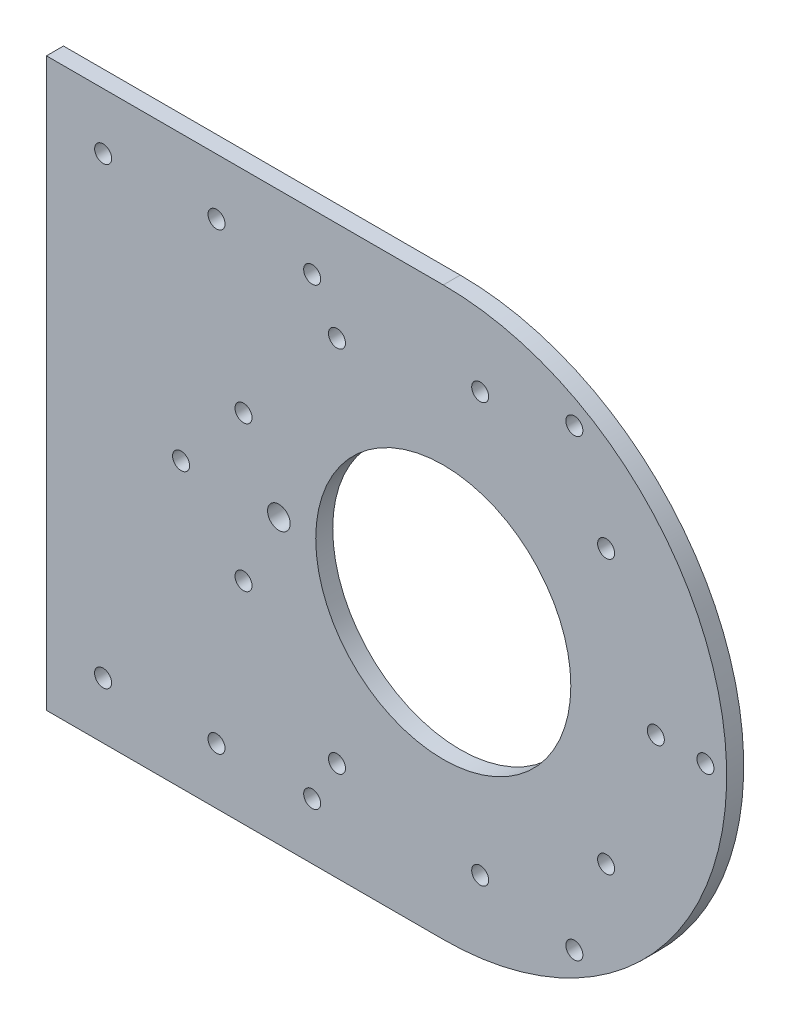
ISO-10303-21;
HEADER;
FILE_DESCRIPTION(('STEP AP214'),'2;1');
FILE_NAME('part.step','',(''),(''),'','','');
FILE_SCHEMA(('AUTOMOTIVE_DESIGN { 1 0 10303 214 1 1 1 1 }'));
ENDSEC;
DATA;
#1=APPLICATION_CONTEXT('core data for automotive mechanical design processes');
#2=APPLICATION_PROTOCOL_DEFINITION('international standard','automotive_design',2000,#1);
#3=PRODUCT_CONTEXT('',#1,'mechanical');
#4=PRODUCT('Part','Part','',(#3));
#5=PRODUCT_RELATED_PRODUCT_CATEGORY('part','',(#4));
#6=PRODUCT_DEFINITION_FORMATION('','',#4);
#7=PRODUCT_DEFINITION_CONTEXT('part definition',#1,'design');
#8=PRODUCT_DEFINITION('design','',#6,#7);
#9=PRODUCT_DEFINITION_SHAPE('','',#8);
#10=(LENGTH_UNIT() NAMED_UNIT(*) SI_UNIT(.MILLI.,.METRE.));
#11=(NAMED_UNIT(*) PLANE_ANGLE_UNIT() SI_UNIT($,.RADIAN.));
#12=(NAMED_UNIT(*) SI_UNIT($,.STERADIAN.) SOLID_ANGLE_UNIT());
#13=UNCERTAINTY_MEASURE_WITH_UNIT(LENGTH_MEASURE(1.E-05),#10,'distance_accuracy_value','');
#14=(GEOMETRIC_REPRESENTATION_CONTEXT(3) GLOBAL_UNCERTAINTY_ASSIGNED_CONTEXT((#13)) GLOBAL_UNIT_ASSIGNED_CONTEXT((#10,
#11,#12)) REPRESENTATION_CONTEXT('',''));
#15=CARTESIAN_POINT('',(0.,0.,0.));
#16=DIRECTION('',(0.,0.,1.));
#17=DIRECTION('',(1.,0.,0.));
#18=AXIS2_PLACEMENT_3D('',#15,#16,#17);
#19=CARTESIAN_POINT('',(0.,50.,3.));
#20=DIRECTION('',(0.,-1.,0.));
#21=DIRECTION('',(1.,0.,0.));
#22=AXIS2_PLACEMENT_3D('',#19,#20,#21);
#23=PLANE('',#22);
#24=DIRECTION('',(0.,0.,-1.));
#25=VECTOR('',#24,1.);
#26=CARTESIAN_POINT('',(-80.,50.,10.));
#27=LINE('',#26,#25);
#28=CARTESIAN_POINT('',(-80.,50.,3.));
#29=VERTEX_POINT('',#28);
#30=CARTESIAN_POINT('',(-80.,50.,0.));
#31=VERTEX_POINT('',#30);
#32=EDGE_CURVE('E58',#29,#31,#27,.T.);
#33=ORIENTED_EDGE('',*,*,#32,.F.);
#34=DIRECTION('',(-1.,0.,0.));
#35=VECTOR('',#34,1.);
#36=CARTESIAN_POINT('',(0.,50.,3.));
#37=LINE('',#36,#35);
#38=CARTESIAN_POINT('',(-9.99999999999995,50.,3.));
#39=VERTEX_POINT('',#38);
#40=EDGE_CURVE('E131',#39,#29,#37,.T.);
#41=ORIENTED_EDGE('',*,*,#40,.F.);
#42=DIRECTION('',(0.,0.,-1.));
#43=VECTOR('',#42,1.);
#44=CARTESIAN_POINT('',(-9.99999999999995,50.,3.));
#45=LINE('',#44,#43);
#46=CARTESIAN_POINT('',(-9.99999999999995,50.,0.));
#47=VERTEX_POINT('',#46);
#48=EDGE_CURVE('E11',#39,#47,#45,.T.);
#49=ORIENTED_EDGE('',*,*,#48,.T.);
#50=DIRECTION('',(-1.,0.,0.));
#51=VECTOR('',#50,1.);
#52=CARTESIAN_POINT('',(0.,50.,0.));
#53=LINE('',#52,#51);
#54=EDGE_CURVE('E90',#47,#31,#53,.T.);
#55=ORIENTED_EDGE('',*,*,#54,.T.);
#56=EDGE_LOOP('',(#33,#41,#49,#55));
#57=FACE_BOUND('',#56,.T.);
#58=ADVANCED_FACE('F43',(#57),#23,.F.);
#59=CARTESIAN_POINT('',(0.,-50.,3.));
#60=DIRECTION('',(0.,-1.,0.));
#61=DIRECTION('',(1.,0.,0.));
#62=AXIS2_PLACEMENT_3D('',#59,#60,#61);
#63=PLANE('',#62);
#64=DIRECTION('',(-1.,0.,0.));
#65=VECTOR('',#64,1.);
#66=CARTESIAN_POINT('',(0.,-50.,3.));
#67=LINE('',#66,#65);
#68=CARTESIAN_POINT('',(-9.99999999999995,-50.,3.));
#69=VERTEX_POINT('',#68);
#70=CARTESIAN_POINT('',(-80.,-50.,3.));
#71=VERTEX_POINT('',#70);
#72=EDGE_CURVE('E134',#69,#71,#67,.T.);
#73=ORIENTED_EDGE('',*,*,#72,.T.);
#74=DIRECTION('',(0.,0.,-1.));
#75=VECTOR('',#74,1.);
#76=CARTESIAN_POINT('',(-80.,-50.,10.));
#77=LINE('',#76,#75);
#78=CARTESIAN_POINT('',(-80.,-50.,0.));
#79=VERTEX_POINT('',#78);
#80=EDGE_CURVE('E96',#71,#79,#77,.T.);
#81=ORIENTED_EDGE('',*,*,#80,.T.);
#82=DIRECTION('',(-1.,0.,0.));
#83=VECTOR('',#82,1.);
#84=CARTESIAN_POINT('',(0.,-50.,0.));
#85=LINE('',#84,#83);
#86=CARTESIAN_POINT('',(-9.99999999999995,-50.,0.));
#87=VERTEX_POINT('',#86);
#88=EDGE_CURVE('E88',#87,#79,#85,.T.);
#89=ORIENTED_EDGE('',*,*,#88,.F.);
#90=DIRECTION('',(0.,0.,-1.));
#91=VECTOR('',#90,1.);
#92=CARTESIAN_POINT('',(-9.99999999999995,-50.,3.));
#93=LINE('',#92,#91);
#94=EDGE_CURVE('E51',#69,#87,#93,.T.);
#95=ORIENTED_EDGE('',*,*,#94,.F.);
#96=EDGE_LOOP('',(#73,#81,#89,#95));
#97=FACE_BOUND('',#96,.T.);
#98=ADVANCED_FACE('F94',(#97),#63,.T.);
#99=CARTESIAN_POINT('',(0.,0.,3.));
#100=DIRECTION('',(0.,0.,1.));
#101=DIRECTION('',(1.,0.,0.));
#102=AXIS2_PLACEMENT_3D('',#99,#100,#101);
#103=PLANE('',#102);
#104=CARTESIAN_POINT('',(-50.0000000000005,40.0519932234892,3.));
#105=DIRECTION('',(0.,0.,1.));
#106=DIRECTION('',(1.,0.,0.));
#107=AXIS2_PLACEMENT_3D('',#104,#105,#106);
#108=CIRCLE('',#107,1.5);
#109=CARTESIAN_POINT('',(-48.5000000000005,40.0519932234892,3.));
#110=VERTEX_POINT('',#109);
#111=EDGE_CURVE('E307',#110,#110,#108,.T.);
#112=ORIENTED_EDGE('',*,*,#111,.F.);
#113=EDGE_LOOP('',(#112));
#114=FACE_BOUND('',#113,.T.);
#115=CARTESIAN_POINT('',(-70.0139684611816,-40.0488491949102,3.));
#116=DIRECTION('',(0.,0.,1.));
#117=DIRECTION('',(1.,0.,0.));
#118=AXIS2_PLACEMENT_3D('',#115,#116,#117);
#119=CIRCLE('',#118,1.5);
#120=CARTESIAN_POINT('',(-68.5139684611816,-40.0488491949102,3.));
#121=VERTEX_POINT('',#120);
#122=EDGE_CURVE('E313',#121,#121,#119,.T.);
#123=ORIENTED_EDGE('',*,*,#122,.F.);
#124=EDGE_LOOP('',(#123));
#125=FACE_BOUND('',#124,.T.);
#126=CARTESIAN_POINT('',(-50.0000000000005,-40.0488491930696,3.));
#127=DIRECTION('',(0.,0.,1.));
#128=DIRECTION('',(1.,0.,0.));
#129=AXIS2_PLACEMENT_3D('',#126,#127,#128);
#130=CIRCLE('',#129,1.5);
#131=CARTESIAN_POINT('',(-48.5000000000005,-40.0488491930696,3.));
#132=VERTEX_POINT('',#131);
#133=EDGE_CURVE('E314',#132,#132,#130,.T.);
#134=ORIENTED_EDGE('',*,*,#133,.F.);
#135=EDGE_LOOP('',(#134));
#136=FACE_BOUND('',#135,.T.);
#137=CARTESIAN_POINT('',(-70.0000000000005,40.0519932234893,3.));
#138=DIRECTION('',(0.,0.,1.));
#139=DIRECTION('',(1.,0.,0.));
#140=AXIS2_PLACEMENT_3D('',#137,#138,#139);
#141=CIRCLE('',#140,1.5);
#142=CARTESIAN_POINT('',(-68.5000000000005,40.0519932234893,3.));
#143=VERTEX_POINT('',#142);
#144=EDGE_CURVE('E304',#143,#143,#141,.T.);
#145=ORIENTED_EDGE('',*,*,#144,.F.);
#146=EDGE_LOOP('',(#145));
#147=FACE_BOUND('',#146,.T.);
#148=CARTESIAN_POINT('',(36.25,0.,3.));
#149=DIRECTION('',(0.,0.,1.));
#150=DIRECTION('',(1.,0.,0.));
#151=AXIS2_PLACEMENT_3D('',#148,#149,#150);
#152=CIRCLE('',#151,1.5);
#153=CARTESIAN_POINT('',(37.75,0.,3.));
#154=VERTEX_POINT('',#153);
#155=EDGE_CURVE('E267',#154,#154,#152,.T.);
#156=ORIENTED_EDGE('',*,*,#155,.F.);
#157=EDGE_LOOP('',(#156));
#158=FACE_BOUND('',#157,.T.);
#159=CARTESIAN_POINT('',(13.1250000000005,-40.05367492503,3.));
#160=DIRECTION('',(0.,0.,1.));
#161=DIRECTION('',(1.,0.,0.));
#162=AXIS2_PLACEMENT_3D('',#159,#160,#161);
#163=CIRCLE('',#162,1.5);
#164=CARTESIAN_POINT('',(14.6250000000005,-40.05367492503,3.));
#165=VERTEX_POINT('',#164);
#166=EDGE_CURVE('E270',#165,#165,#163,.T.);
#167=ORIENTED_EDGE('',*,*,#166,.F.);
#168=EDGE_LOOP('',(#167));
#169=FACE_BOUND('',#168,.T.);
#170=CARTESIAN_POINT('',(-33.1249999999996,-40.0536749250305,3.));
#171=DIRECTION('',(0.,0.,1.));
#172=DIRECTION('',(1.,0.,0.));
#173=AXIS2_PLACEMENT_3D('',#170,#171,#172);
#174=CIRCLE('',#173,1.5);
#175=CARTESIAN_POINT('',(-31.6249999999996,-40.0536749250305,3.));
#176=VERTEX_POINT('',#175);
#177=EDGE_CURVE('E273',#176,#176,#174,.T.);
#178=ORIENTED_EDGE('',*,*,#177,.F.);
#179=EDGE_LOOP('',(#178));
#180=FACE_BOUND('',#179,.T.);
#181=CARTESIAN_POINT('',(-56.25,-2.8132403267198E-13,3.));
#182=DIRECTION('',(0.,0.,1.));
#183=DIRECTION('',(1.,0.,0.));
#184=AXIS2_PLACEMENT_3D('',#181,#182,#183);
#185=CIRCLE('',#184,1.49999999999999);
#186=CARTESIAN_POINT('',(-54.75,-2.8132403267198E-13,3.));
#187=VERTEX_POINT('',#186);
#188=EDGE_CURVE('E276',#187,#187,#185,.T.);
#189=ORIENTED_EDGE('',*,*,#188,.F.);
#190=EDGE_LOOP('',(#189));
#191=FACE_BOUND('',#190,.T.);
#192=CARTESIAN_POINT('',(-33.1250000000001,40.0536749250302,3.));
#193=DIRECTION('',(0.,0.,1.));
#194=DIRECTION('',(1.,0.,0.));
#195=AXIS2_PLACEMENT_3D('',#192,#193,#194);
#196=CIRCLE('',#195,1.5);
#197=CARTESIAN_POINT('',(-31.6250000000001,40.0536749250302,3.));
#198=VERTEX_POINT('',#197);
#199=EDGE_CURVE('E279',#198,#198,#196,.T.);
#200=ORIENTED_EDGE('',*,*,#199,.F.);
#201=EDGE_LOOP('',(#200));
#202=FACE_BOUND('',#201,.T.);
#203=CARTESIAN_POINT('',(13.125,40.0536749250304,3.));
#204=DIRECTION('',(0.,0.,1.));
#205=DIRECTION('',(1.,0.,0.));
#206=AXIS2_PLACEMENT_3D('',#203,#204,#205);
#207=CIRCLE('',#206,1.5);
#208=CARTESIAN_POINT('',(14.625,40.0536749250304,3.));
#209=VERTEX_POINT('',#208);
#210=EDGE_CURVE('E282',#209,#209,#207,.T.);
#211=ORIENTED_EDGE('',*,*,#210,.F.);
#212=EDGE_LOOP('',(#211));
#213=FACE_BOUND('',#212,.T.);
#214=CARTESIAN_POINT('',(27.5,0.,3.));
#215=DIRECTION('',(0.,0.,1.));
#216=DIRECTION('',(1.,0.,0.));
#217=AXIS2_PLACEMENT_3D('',#214,#215,#216);
#218=CIRCLE('',#217,1.50000000000002);
#219=CARTESIAN_POINT('',(29.,0.,3.));
#220=VERTEX_POINT('',#219);
#221=EDGE_CURVE('E82',#220,#220,#218,.F.);
#222=ORIENTED_EDGE('',*,*,#221,.T.);
#223=EDGE_LOOP('',(#222));
#224=FACE_BOUND('',#223,.T.);
#225=CARTESIAN_POINT('',(-3.48819333749006,36.9302907379578,3.));
#226=DIRECTION('',(0.,0.,1.));
#227=DIRECTION('',(1.,0.,0.));
#228=AXIS2_PLACEMENT_3D('',#225,#226,#227);
#229=CIRCLE('',#228,1.50000000000003);
#230=CARTESIAN_POINT('',(-1.98819333749003,36.9302907379578,3.));
#231=VERTEX_POINT('',#230);
#232=EDGE_CURVE('E164',#231,#231,#229,.F.);
#233=ORIENTED_EDGE('',*,*,#232,.T.);
#234=EDGE_LOOP('',(#233));
#235=FACE_BOUND('',#234,.T.);
#236=CARTESIAN_POINT('',(-45.2384732794714,12.8257553747126,3.));
#237=DIRECTION('',(0.,0.,1.));
#238=DIRECTION('',(1.,0.,0.));
#239=AXIS2_PLACEMENT_3D('',#236,#237,#238);
#240=CIRCLE('',#239,1.50000000000003);
#241=CARTESIAN_POINT('',(-43.7384732794714,12.8257553747126,3.));
#242=VERTEX_POINT('',#241);
#243=EDGE_CURVE('E161',#242,#242,#240,.F.);
#244=ORIENTED_EDGE('',*,*,#243,.T.);
#245=EDGE_LOOP('',(#244));
#246=FACE_BOUND('',#245,.T.);
#247=CARTESIAN_POINT('',(-28.7499999999999,-32.4759526419164,3.));
#248=DIRECTION('',(0.,0.,1.));
#249=DIRECTION('',(1.,0.,0.));
#250=AXIS2_PLACEMENT_3D('',#247,#248,#249);
#251=CIRCLE('',#250,1.49999999999999);
#252=CARTESIAN_POINT('',(-27.2499999999999,-32.4759526419164,3.));
#253=VERTEX_POINT('',#252);
#254=EDGE_CURVE('E158',#253,#253,#251,.F.);
#255=ORIENTED_EDGE('',*,*,#254,.T.);
#256=EDGE_LOOP('',(#255));
#257=FACE_BOUND('',#256,.T.);
#258=CARTESIAN_POINT('',(18.7266666169617,-24.1045353632451,3.));
#259=DIRECTION('',(0.,0.,1.));
#260=DIRECTION('',(1.,0.,0.));
#261=AXIS2_PLACEMENT_3D('',#258,#259,#260);
#262=CIRCLE('',#261,1.50000000000003);
#263=CARTESIAN_POINT('',(20.2266666169617,-24.1045353632451,3.));
#264=VERTEX_POINT('',#263);
#265=EDGE_CURVE('E155',#264,#264,#262,.F.);
#266=ORIENTED_EDGE('',*,*,#265,.T.);
#267=EDGE_LOOP('',(#266));
#268=FACE_BOUND('',#267,.T.);
#269=CARTESIAN_POINT('',(-9.99999999999995,0.,3.));
#270=DIRECTION('',(0.,0.,1.));
#271=DIRECTION('',(1.,0.,0.));
#272=AXIS2_PLACEMENT_3D('',#269,#270,#271);
#273=CIRCLE('',#272,22.5);
#274=CARTESIAN_POINT('',(12.5000000000001,0.,3.));
#275=VERTEX_POINT('',#274);
#276=EDGE_CURVE('E152',#275,#275,#273,.F.);
#277=ORIENTED_EDGE('',*,*,#276,.T.);
#278=EDGE_LOOP('',(#277));
#279=FACE_BOUND('',#278,.T.);
#280=CARTESIAN_POINT('',(-3.48819333749006,-36.9302907379577,3.));
#281=DIRECTION('',(0.,0.,1.));
#282=DIRECTION('',(1.,0.,0.));
#283=AXIS2_PLACEMENT_3D('',#280,#281,#282);
#284=CIRCLE('',#283,1.49999999999999);
#285=CARTESIAN_POINT('',(-1.98819333749008,-36.9302907379577,3.));
#286=VERTEX_POINT('',#285);
#287=EDGE_CURVE('E149',#286,#286,#284,.F.);
#288=ORIENTED_EDGE('',*,*,#287,.T.);
#289=EDGE_LOOP('',(#288));
#290=FACE_BOUND('',#289,.T.);
#291=CARTESIAN_POINT('',(-45.2384732794714,-12.8257553747125,3.));
#292=DIRECTION('',(0.,0.,1.));
#293=DIRECTION('',(1.,0.,0.));
#294=AXIS2_PLACEMENT_3D('',#291,#292,#293);
#295=CIRCLE('',#294,1.49999999999999);
#296=CARTESIAN_POINT('',(-43.7384732794715,-12.8257553747125,3.));
#297=VERTEX_POINT('',#296);
#298=EDGE_CURVE('E146',#297,#297,#295,.F.);
#299=ORIENTED_EDGE('',*,*,#298,.T.);
#300=EDGE_LOOP('',(#299));
#301=FACE_BOUND('',#300,.T.);
#302=CARTESIAN_POINT('',(-28.75,32.4759526419165,3.));
#303=DIRECTION('',(0.,0.,1.));
#304=DIRECTION('',(1.,0.,0.));
#305=AXIS2_PLACEMENT_3D('',#302,#303,#304);
#306=CIRCLE('',#305,1.50000000000003);
#307=CARTESIAN_POINT('',(-27.25,32.4759526419165,3.));
#308=VERTEX_POINT('',#307);
#309=EDGE_CURVE('E143',#308,#308,#306,.F.);
#310=ORIENTED_EDGE('',*,*,#309,.T.);
#311=EDGE_LOOP('',(#310));
#312=FACE_BOUND('',#311,.T.);
#313=CARTESIAN_POINT('',(18.7266666169617,24.1045353632453,3.));
#314=DIRECTION('',(0.,0.,1.));
#315=DIRECTION('',(1.,0.,0.));
#316=AXIS2_PLACEMENT_3D('',#313,#314,#315);
#317=CIRCLE('',#316,1.50000000000007);
#318=CARTESIAN_POINT('',(20.2266666169618,24.1045353632453,3.));
#319=VERTEX_POINT('',#318);
#320=EDGE_CURVE('E140',#319,#319,#317,.F.);
#321=ORIENTED_EDGE('',*,*,#320,.T.);
#322=EDGE_LOOP('',(#321));
#323=FACE_BOUND('',#322,.T.);
#324=CARTESIAN_POINT('',(-39.,0.,3.));
#325=DIRECTION('',(0.,0.,1.));
#326=DIRECTION('',(1.,0.,0.));
#327=AXIS2_PLACEMENT_3D('',#324,#325,#326);
#328=CIRCLE('',#327,2.);
#329=CARTESIAN_POINT('',(-37.,0.,3.));
#330=VERTEX_POINT('',#329);
#331=EDGE_CURVE('E91',#330,#330,#328,.T.);
#332=ORIENTED_EDGE('',*,*,#331,.F.);
#333=EDGE_LOOP('',(#332));
#334=FACE_BOUND('',#333,.T.);
#335=ORIENTED_EDGE('',*,*,#40,.T.);
#336=DIRECTION('',(0.,-1.,0.));
#337=VECTOR('',#336,1.);
#338=CARTESIAN_POINT('',(-80.,0.,3.));
#339=LINE('',#338,#337);
#340=EDGE_CURVE('E258',#29,#71,#339,.T.);
#341=ORIENTED_EDGE('',*,*,#340,.T.);
#342=ORIENTED_EDGE('',*,*,#72,.F.);
#343=CARTESIAN_POINT('',(-9.99999999999995,0.,3.));
#344=DIRECTION('',(0.,0.,1.));
#345=DIRECTION('',(1.,0.,0.));
#346=AXIS2_PLACEMENT_3D('',#343,#344,#345);
#347=CIRCLE('',#346,50.);
#348=EDGE_CURVE('E80',#39,#69,#347,.F.);
#349=ORIENTED_EDGE('',*,*,#348,.F.);
#350=EDGE_LOOP('',(#335,#341,#342,#349));
#351=FACE_BOUND('',#350,.T.);
#352=ADVANCED_FACE('F170',(#114,#125,#136,#147,#158,#169,#180,#191,#202,#213,#224,#235,#246,
#257,#268,#279,#290,#301,#312,#323,#334,#351),#103,.T.);
#353=CARTESIAN_POINT('',(0.,0.,0.));
#354=DIRECTION('',(0.,0.,1.));
#355=DIRECTION('',(1.,0.,0.));
#356=AXIS2_PLACEMENT_3D('',#353,#354,#355);
#357=PLANE('',#356);
#358=CARTESIAN_POINT('',(-50.0000000000005,40.0519932234892,0.));
#359=DIRECTION('',(0.,0.,1.));
#360=DIRECTION('',(1.,0.,0.));
#361=AXIS2_PLACEMENT_3D('',#358,#359,#360);
#362=CIRCLE('',#361,1.5);
#363=CARTESIAN_POINT('',(-48.5000000000005,40.0519932234892,0.));
#364=VERTEX_POINT('',#363);
#365=EDGE_CURVE('E317',#364,#364,#362,.T.);
#366=ORIENTED_EDGE('',*,*,#365,.T.);
#367=EDGE_LOOP('',(#366));
#368=FACE_BOUND('',#367,.T.);
#369=CARTESIAN_POINT('',(-70.0139684611816,-40.0488491949102,0.));
#370=DIRECTION('',(0.,0.,1.));
#371=DIRECTION('',(1.,0.,0.));
#372=AXIS2_PLACEMENT_3D('',#369,#370,#371);
#373=CIRCLE('',#372,1.5);
#374=CARTESIAN_POINT('',(-68.5139684611816,-40.0488491949102,0.));
#375=VERTEX_POINT('',#374);
#376=EDGE_CURVE('E310',#375,#375,#373,.T.);
#377=ORIENTED_EDGE('',*,*,#376,.T.);
#378=EDGE_LOOP('',(#377));
#379=FACE_BOUND('',#378,.T.);
#380=CARTESIAN_POINT('',(-50.0000000000005,-40.0488491930696,0.));
#381=DIRECTION('',(0.,0.,1.));
#382=DIRECTION('',(1.,0.,0.));
#383=AXIS2_PLACEMENT_3D('',#380,#381,#382);
#384=CIRCLE('',#383,1.5);
#385=CARTESIAN_POINT('',(-48.5000000000005,-40.0488491930696,0.));
#386=VERTEX_POINT('',#385);
#387=EDGE_CURVE('E322',#386,#386,#384,.T.);
#388=ORIENTED_EDGE('',*,*,#387,.T.);
#389=EDGE_LOOP('',(#388));
#390=FACE_BOUND('',#389,.T.);
#391=CARTESIAN_POINT('',(-70.0000000000005,40.0519932234893,0.));
#392=DIRECTION('',(0.,0.,1.));
#393=DIRECTION('',(1.,0.,0.));
#394=AXIS2_PLACEMENT_3D('',#391,#392,#393);
#395=CIRCLE('',#394,1.5);
#396=CARTESIAN_POINT('',(-68.5000000000005,40.0519932234893,0.));
#397=VERTEX_POINT('',#396);
#398=EDGE_CURVE('E301',#397,#397,#395,.T.);
#399=ORIENTED_EDGE('',*,*,#398,.T.);
#400=EDGE_LOOP('',(#399));
#401=FACE_BOUND('',#400,.T.);
#402=CARTESIAN_POINT('',(36.25,0.,0.));
#403=DIRECTION('',(0.,0.,-1.));
#404=DIRECTION('',(-1.,0.,0.));
#405=AXIS2_PLACEMENT_3D('',#402,#403,#404);
#406=CIRCLE('',#405,1.5);
#407=CARTESIAN_POINT('',(34.75,0.,0.));
#408=VERTEX_POINT('',#407);
#409=EDGE_CURVE('E285',#408,#408,#406,.T.);
#410=ORIENTED_EDGE('',*,*,#409,.F.);
#411=EDGE_LOOP('',(#410));
#412=FACE_BOUND('',#411,.T.);
#413=CARTESIAN_POINT('',(13.1250000000005,-40.05367492503,0.));
#414=DIRECTION('',(0.,0.,-1.));
#415=DIRECTION('',(-1.,0.,0.));
#416=AXIS2_PLACEMENT_3D('',#413,#414,#415);
#417=CIRCLE('',#416,1.5);
#418=CARTESIAN_POINT('',(11.6250000000005,-40.05367492503,0.));
#419=VERTEX_POINT('',#418);
#420=EDGE_CURVE('E290',#419,#419,#417,.T.);
#421=ORIENTED_EDGE('',*,*,#420,.F.);
#422=EDGE_LOOP('',(#421));
#423=FACE_BOUND('',#422,.T.);
#424=CARTESIAN_POINT('',(-33.1249999999996,-40.0536749250305,0.));
#425=DIRECTION('',(0.,0.,-1.));
#426=DIRECTION('',(-1.,0.,0.));
#427=AXIS2_PLACEMENT_3D('',#424,#425,#426);
#428=CIRCLE('',#427,1.5);
#429=CARTESIAN_POINT('',(-34.6249999999996,-40.0536749250305,0.));
#430=VERTEX_POINT('',#429);
#431=EDGE_CURVE('E286',#430,#430,#428,.T.);
#432=ORIENTED_EDGE('',*,*,#431,.F.);
#433=EDGE_LOOP('',(#432));
#434=FACE_BOUND('',#433,.T.);
#435=CARTESIAN_POINT('',(-56.25,-2.8132403267198E-13,0.));
#436=DIRECTION('',(0.,0.,-1.));
#437=DIRECTION('',(-1.,0.,0.));
#438=AXIS2_PLACEMENT_3D('',#435,#436,#437);
#439=CIRCLE('',#438,1.49999999999999);
#440=CARTESIAN_POINT('',(-57.75,-2.8132403267198E-13,0.));
#441=VERTEX_POINT('',#440);
#442=EDGE_CURVE('E289',#441,#441,#439,.T.);
#443=ORIENTED_EDGE('',*,*,#442,.F.);
#444=EDGE_LOOP('',(#443));
#445=FACE_BOUND('',#444,.T.);
#446=CARTESIAN_POINT('',(-33.1250000000001,40.0536749250302,0.));
#447=DIRECTION('',(0.,0.,-1.));
#448=DIRECTION('',(-1.,0.,0.));
#449=AXIS2_PLACEMENT_3D('',#446,#447,#448);
#450=CIRCLE('',#449,1.5);
#451=CARTESIAN_POINT('',(-34.6250000000001,40.0536749250302,0.));
#452=VERTEX_POINT('',#451);
#453=EDGE_CURVE('E293',#452,#452,#450,.T.);
#454=ORIENTED_EDGE('',*,*,#453,.F.);
#455=EDGE_LOOP('',(#454));
#456=FACE_BOUND('',#455,.T.);
#457=CARTESIAN_POINT('',(13.125,40.0536749250304,0.));
#458=DIRECTION('',(0.,0.,-1.));
#459=DIRECTION('',(-1.,0.,0.));
#460=AXIS2_PLACEMENT_3D('',#457,#458,#459);
#461=CIRCLE('',#460,1.5);
#462=CARTESIAN_POINT('',(11.625,40.0536749250304,0.));
#463=VERTEX_POINT('',#462);
#464=EDGE_CURVE('E296',#463,#463,#461,.T.);
#465=ORIENTED_EDGE('',*,*,#464,.F.);
#466=EDGE_LOOP('',(#465));
#467=FACE_BOUND('',#466,.T.);
#468=CARTESIAN_POINT('',(27.5,0.,0.));
#469=DIRECTION('',(0.,0.,1.));
#470=DIRECTION('',(1.,0.,0.));
#471=AXIS2_PLACEMENT_3D('',#468,#469,#470);
#472=CIRCLE('',#471,1.50000000000002);
#473=CARTESIAN_POINT('',(29.,0.,0.));
#474=VERTEX_POINT('',#473);
#475=EDGE_CURVE('E127',#474,#474,#472,.F.);
#476=ORIENTED_EDGE('',*,*,#475,.F.);
#477=EDGE_LOOP('',(#476));
#478=FACE_BOUND('',#477,.T.);
#479=CARTESIAN_POINT('',(-3.48819333749006,36.9302907379578,0.));
#480=DIRECTION('',(0.,0.,1.));
#481=DIRECTION('',(1.,0.,0.));
#482=AXIS2_PLACEMENT_3D('',#479,#480,#481);
#483=CIRCLE('',#482,1.50000000000003);
#484=CARTESIAN_POINT('',(-1.98819333749003,36.9302907379578,0.));
#485=VERTEX_POINT('',#484);
#486=EDGE_CURVE('E124',#485,#485,#483,.F.);
#487=ORIENTED_EDGE('',*,*,#486,.F.);
#488=EDGE_LOOP('',(#487));
#489=FACE_BOUND('',#488,.T.);
#490=CARTESIAN_POINT('',(-45.2384732794714,12.8257553747126,0.));
#491=DIRECTION('',(0.,0.,1.));
#492=DIRECTION('',(1.,0.,0.));
#493=AXIS2_PLACEMENT_3D('',#490,#491,#492);
#494=CIRCLE('',#493,1.50000000000003);
#495=CARTESIAN_POINT('',(-43.7384732794714,12.8257553747126,0.));
#496=VERTEX_POINT('',#495);
#497=EDGE_CURVE('E121',#496,#496,#494,.F.);
#498=ORIENTED_EDGE('',*,*,#497,.F.);
#499=EDGE_LOOP('',(#498));
#500=FACE_BOUND('',#499,.T.);
#501=CARTESIAN_POINT('',(-28.7499999999999,-32.4759526419164,0.));
#502=DIRECTION('',(0.,0.,1.));
#503=DIRECTION('',(1.,0.,0.));
#504=AXIS2_PLACEMENT_3D('',#501,#502,#503);
#505=CIRCLE('',#504,1.49999999999999);
#506=CARTESIAN_POINT('',(-27.2499999999999,-32.4759526419164,0.));
#507=VERTEX_POINT('',#506);
#508=EDGE_CURVE('E118',#507,#507,#505,.F.);
#509=ORIENTED_EDGE('',*,*,#508,.F.);
#510=EDGE_LOOP('',(#509));
#511=FACE_BOUND('',#510,.T.);
#512=CARTESIAN_POINT('',(18.7266666169617,-24.1045353632451,0.));
#513=DIRECTION('',(0.,0.,1.));
#514=DIRECTION('',(1.,0.,0.));
#515=AXIS2_PLACEMENT_3D('',#512,#513,#514);
#516=CIRCLE('',#515,1.50000000000003);
#517=CARTESIAN_POINT('',(20.2266666169617,-24.1045353632451,0.));
#518=VERTEX_POINT('',#517);
#519=EDGE_CURVE('E115',#518,#518,#516,.F.);
#520=ORIENTED_EDGE('',*,*,#519,.F.);
#521=EDGE_LOOP('',(#520));
#522=FACE_BOUND('',#521,.T.);
#523=CARTESIAN_POINT('',(-9.99999999999995,0.,0.));
#524=DIRECTION('',(0.,0.,1.));
#525=DIRECTION('',(1.,0.,0.));
#526=AXIS2_PLACEMENT_3D('',#523,#524,#525);
#527=CIRCLE('',#526,22.5);
#528=CARTESIAN_POINT('',(12.5000000000001,0.,0.));
#529=VERTEX_POINT('',#528);
#530=EDGE_CURVE('E112',#529,#529,#527,.F.);
#531=ORIENTED_EDGE('',*,*,#530,.F.);
#532=EDGE_LOOP('',(#531));
#533=FACE_BOUND('',#532,.T.);
#534=CARTESIAN_POINT('',(-3.48819333749006,-36.9302907379577,0.));
#535=DIRECTION('',(0.,0.,1.));
#536=DIRECTION('',(1.,0.,0.));
#537=AXIS2_PLACEMENT_3D('',#534,#535,#536);
#538=CIRCLE('',#537,1.49999999999999);
#539=CARTESIAN_POINT('',(-1.98819333749008,-36.9302907379577,0.));
#540=VERTEX_POINT('',#539);
#541=EDGE_CURVE('E109',#540,#540,#538,.F.);
#542=ORIENTED_EDGE('',*,*,#541,.F.);
#543=EDGE_LOOP('',(#542));
#544=FACE_BOUND('',#543,.T.);
#545=CARTESIAN_POINT('',(-45.2384732794714,-12.8257553747125,0.));
#546=DIRECTION('',(0.,0.,1.));
#547=DIRECTION('',(1.,0.,0.));
#548=AXIS2_PLACEMENT_3D('',#545,#546,#547);
#549=CIRCLE('',#548,1.49999999999999);
#550=CARTESIAN_POINT('',(-43.7384732794715,-12.8257553747125,0.));
#551=VERTEX_POINT('',#550);
#552=EDGE_CURVE('E106',#551,#551,#549,.F.);
#553=ORIENTED_EDGE('',*,*,#552,.F.);
#554=EDGE_LOOP('',(#553));
#555=FACE_BOUND('',#554,.T.);
#556=CARTESIAN_POINT('',(-28.75,32.4759526419165,0.));
#557=DIRECTION('',(0.,0.,1.));
#558=DIRECTION('',(1.,0.,0.));
#559=AXIS2_PLACEMENT_3D('',#556,#557,#558);
#560=CIRCLE('',#559,1.50000000000003);
#561=CARTESIAN_POINT('',(-27.25,32.4759526419165,0.));
#562=VERTEX_POINT('',#561);
#563=EDGE_CURVE('E100',#562,#562,#560,.F.);
#564=ORIENTED_EDGE('',*,*,#563,.F.);
#565=EDGE_LOOP('',(#564));
#566=FACE_BOUND('',#565,.T.);
#567=CARTESIAN_POINT('',(18.7266666169617,24.1045353632453,0.));
#568=DIRECTION('',(0.,0.,1.));
#569=DIRECTION('',(1.,0.,0.));
#570=AXIS2_PLACEMENT_3D('',#567,#568,#569);
#571=CIRCLE('',#570,1.50000000000007);
#572=CARTESIAN_POINT('',(20.2266666169618,24.1045353632453,0.));
#573=VERTEX_POINT('',#572);
#574=EDGE_CURVE('E97',#573,#573,#571,.F.);
#575=ORIENTED_EDGE('',*,*,#574,.F.);
#576=EDGE_LOOP('',(#575));
#577=FACE_BOUND('',#576,.T.);
#578=CARTESIAN_POINT('',(-39.,0.,0.));
#579=DIRECTION('',(0.,0.,-1.));
#580=DIRECTION('',(-1.,0.,0.));
#581=AXIS2_PLACEMENT_3D('',#578,#579,#580);
#582=CIRCLE('',#581,2.);
#583=CARTESIAN_POINT('',(-41.,0.,0.));
#584=VERTEX_POINT('',#583);
#585=EDGE_CURVE('E256',#584,#584,#582,.T.);
#586=ORIENTED_EDGE('',*,*,#585,.F.);
#587=EDGE_LOOP('',(#586));
#588=FACE_BOUND('',#587,.T.);
#589=DIRECTION('',(0.,1.,0.));
#590=VECTOR('',#589,1.);
#591=CARTESIAN_POINT('',(-80.,0.,0.));
#592=LINE('',#591,#590);
#593=EDGE_CURVE('E264',#79,#31,#592,.T.);
#594=ORIENTED_EDGE('',*,*,#593,.T.);
#595=ORIENTED_EDGE('',*,*,#54,.F.);
#596=CARTESIAN_POINT('',(-9.99999999999995,0.,0.));
#597=DIRECTION('',(0.,0.,1.));
#598=DIRECTION('',(1.,0.,0.));
#599=AXIS2_PLACEMENT_3D('',#596,#597,#598);
#600=CIRCLE('',#599,50.);
#601=EDGE_CURVE('E78',#47,#87,#600,.F.);
#602=ORIENTED_EDGE('',*,*,#601,.T.);
#603=ORIENTED_EDGE('',*,*,#88,.T.);
#604=EDGE_LOOP('',(#594,#595,#602,#603));
#605=FACE_BOUND('',#604,.T.);
#606=ADVANCED_FACE('F86',(#368,#379,#390,#401,#412,#423,#434,#445,#456,#467,#478,#489,#500,#511,
#522,#533,#544,#555,#566,#577,#588,#605),#357,.F.);
#607=CARTESIAN_POINT('',(-9.99999999999995,0.,3.));
#608=DIRECTION('',(0.,0.,-1.));
#609=DIRECTION('',(-1.,0.,0.));
#610=AXIS2_PLACEMENT_3D('',#607,#608,#609);
#611=CYLINDRICAL_SURFACE('',#610,50.);
#612=ORIENTED_EDGE('',*,*,#601,.F.);
#613=ORIENTED_EDGE('',*,*,#48,.F.);
#614=ORIENTED_EDGE('',*,*,#348,.T.);
#615=ORIENTED_EDGE('',*,*,#94,.T.);
#616=EDGE_LOOP('',(#612,#613,#614,#615));
#617=FACE_BOUND('',#616,.T.);
#618=ADVANCED_FACE('F45',(#617),#611,.T.);
#619=CARTESIAN_POINT('',(-3.48819333749006,36.9302907379578,3.));
#620=DIRECTION('',(0.,0.,-1.));
#621=DIRECTION('',(-1.,0.,0.));
#622=AXIS2_PLACEMENT_3D('',#619,#620,#621);
#623=CYLINDRICAL_SURFACE('',#622,1.50000000000003);
#624=ORIENTED_EDGE('',*,*,#232,.F.);
#625=EDGE_LOOP('',(#624));
#626=FACE_BOUND('',#625,.T.);
#627=ORIENTED_EDGE('',*,*,#486,.T.);
#628=EDGE_LOOP('',(#627));
#629=FACE_BOUND('',#628,.T.);
#630=ADVANCED_FACE('F224',(#626,#629),#623,.F.);
#631=CARTESIAN_POINT('',(-45.2384732794714,12.8257553747126,3.));
#632=DIRECTION('',(0.,0.,-1.));
#633=DIRECTION('',(-1.,0.,0.));
#634=AXIS2_PLACEMENT_3D('',#631,#632,#633);
#635=CYLINDRICAL_SURFACE('',#634,1.50000000000003);
#636=ORIENTED_EDGE('',*,*,#243,.F.);
#637=EDGE_LOOP('',(#636));
#638=FACE_BOUND('',#637,.T.);
#639=ORIENTED_EDGE('',*,*,#497,.T.);
#640=EDGE_LOOP('',(#639));
#641=FACE_BOUND('',#640,.T.);
#642=ADVANCED_FACE('F221',(#638,#641),#635,.F.);
#643=CARTESIAN_POINT('',(-28.7499999999999,-32.4759526419164,3.));
#644=DIRECTION('',(0.,0.,-1.));
#645=DIRECTION('',(-1.,0.,0.));
#646=AXIS2_PLACEMENT_3D('',#643,#644,#645);
#647=CYLINDRICAL_SURFACE('',#646,1.49999999999999);
#648=ORIENTED_EDGE('',*,*,#254,.F.);
#649=EDGE_LOOP('',(#648));
#650=FACE_BOUND('',#649,.T.);
#651=ORIENTED_EDGE('',*,*,#508,.T.);
#652=EDGE_LOOP('',(#651));
#653=FACE_BOUND('',#652,.T.);
#654=ADVANCED_FACE('F217',(#650,#653),#647,.F.);
#655=CARTESIAN_POINT('',(18.7266666169617,-24.1045353632451,3.));
#656=DIRECTION('',(0.,0.,-1.));
#657=DIRECTION('',(-1.,0.,0.));
#658=AXIS2_PLACEMENT_3D('',#655,#656,#657);
#659=CYLINDRICAL_SURFACE('',#658,1.50000000000003);
#660=ORIENTED_EDGE('',*,*,#265,.F.);
#661=EDGE_LOOP('',(#660));
#662=FACE_BOUND('',#661,.T.);
#663=ORIENTED_EDGE('',*,*,#519,.T.);
#664=EDGE_LOOP('',(#663));
#665=FACE_BOUND('',#664,.T.);
#666=ADVANCED_FACE('F213',(#662,#665),#659,.F.);
#667=CARTESIAN_POINT('',(-9.99999999999995,0.,3.));
#668=DIRECTION('',(0.,0.,-1.));
#669=DIRECTION('',(-1.,0.,0.));
#670=AXIS2_PLACEMENT_3D('',#667,#668,#669);
#671=CYLINDRICAL_SURFACE('',#670,22.5);
#672=ORIENTED_EDGE('',*,*,#276,.F.);
#673=EDGE_LOOP('',(#672));
#674=FACE_BOUND('',#673,.T.);
#675=ORIENTED_EDGE('',*,*,#530,.T.);
#676=EDGE_LOOP('',(#675));
#677=FACE_BOUND('',#676,.T.);
#678=ADVANCED_FACE('F209',(#674,#677),#671,.F.);
#679=CARTESIAN_POINT('',(-3.48819333749006,-36.9302907379577,3.));
#680=DIRECTION('',(0.,0.,-1.));
#681=DIRECTION('',(-1.,0.,0.));
#682=AXIS2_PLACEMENT_3D('',#679,#680,#681);
#683=CYLINDRICAL_SURFACE('',#682,1.49999999999999);
#684=ORIENTED_EDGE('',*,*,#287,.F.);
#685=EDGE_LOOP('',(#684));
#686=FACE_BOUND('',#685,.T.);
#687=ORIENTED_EDGE('',*,*,#541,.T.);
#688=EDGE_LOOP('',(#687));
#689=FACE_BOUND('',#688,.T.);
#690=ADVANCED_FACE('F205',(#686,#689),#683,.F.);
#691=CARTESIAN_POINT('',(-45.2384732794714,-12.8257553747125,3.));
#692=DIRECTION('',(0.,0.,-1.));
#693=DIRECTION('',(-1.,0.,0.));
#694=AXIS2_PLACEMENT_3D('',#691,#692,#693);
#695=CYLINDRICAL_SURFACE('',#694,1.49999999999999);
#696=ORIENTED_EDGE('',*,*,#298,.F.);
#697=EDGE_LOOP('',(#696));
#698=FACE_BOUND('',#697,.T.);
#699=ORIENTED_EDGE('',*,*,#552,.T.);
#700=EDGE_LOOP('',(#699));
#701=FACE_BOUND('',#700,.T.);
#702=ADVANCED_FACE('F201',(#698,#701),#695,.F.);
#703=CARTESIAN_POINT('',(-28.75,32.4759526419165,3.));
#704=DIRECTION('',(0.,0.,-1.));
#705=DIRECTION('',(-1.,0.,0.));
#706=AXIS2_PLACEMENT_3D('',#703,#704,#705);
#707=CYLINDRICAL_SURFACE('',#706,1.50000000000003);
#708=ORIENTED_EDGE('',*,*,#309,.F.);
#709=EDGE_LOOP('',(#708));
#710=FACE_BOUND('',#709,.T.);
#711=ORIENTED_EDGE('',*,*,#563,.T.);
#712=EDGE_LOOP('',(#711));
#713=FACE_BOUND('',#712,.T.);
#714=ADVANCED_FACE('F186',(#710,#713),#707,.F.);
#715=CARTESIAN_POINT('',(18.7266666169617,24.1045353632453,3.));
#716=DIRECTION('',(0.,0.,-1.));
#717=DIRECTION('',(-1.,0.,0.));
#718=AXIS2_PLACEMENT_3D('',#715,#716,#717);
#719=CYLINDRICAL_SURFACE('',#718,1.50000000000007);
#720=ORIENTED_EDGE('',*,*,#320,.F.);
#721=EDGE_LOOP('',(#720));
#722=FACE_BOUND('',#721,.T.);
#723=ORIENTED_EDGE('',*,*,#574,.T.);
#724=EDGE_LOOP('',(#723));
#725=FACE_BOUND('',#724,.T.);
#726=ADVANCED_FACE('F176',(#722,#725),#719,.F.);
#727=CARTESIAN_POINT('',(27.5,0.,3.));
#728=DIRECTION('',(0.,0.,-1.));
#729=DIRECTION('',(-1.,0.,0.));
#730=AXIS2_PLACEMENT_3D('',#727,#728,#729);
#731=CYLINDRICAL_SURFACE('',#730,1.50000000000002);
#732=ORIENTED_EDGE('',*,*,#221,.F.);
#733=EDGE_LOOP('',(#732));
#734=FACE_BOUND('',#733,.T.);
#735=ORIENTED_EDGE('',*,*,#475,.T.);
#736=EDGE_LOOP('',(#735));
#737=FACE_BOUND('',#736,.T.);
#738=ADVANCED_FACE('F173',(#734,#737),#731,.F.);
#739=CARTESIAN_POINT('',(-39.,0.,10.));
#740=DIRECTION('',(0.,0.,-1.));
#741=DIRECTION('',(-1.,0.,0.));
#742=AXIS2_PLACEMENT_3D('',#739,#740,#741);
#743=CYLINDRICAL_SURFACE('',#742,2.);
#744=ORIENTED_EDGE('',*,*,#331,.T.);
#745=EDGE_LOOP('',(#744));
#746=FACE_BOUND('',#745,.T.);
#747=ORIENTED_EDGE('',*,*,#585,.T.);
#748=EDGE_LOOP('',(#747));
#749=FACE_BOUND('',#748,.T.);
#750=ADVANCED_FACE('F175',(#746,#749),#743,.F.);
#751=CARTESIAN_POINT('',(-80.,0.,10.));
#752=DIRECTION('',(-1.,0.,0.));
#753=DIRECTION('',(0.,0.,1.));
#754=AXIS2_PLACEMENT_3D('',#751,#752,#753);
#755=PLANE('',#754);
#756=ORIENTED_EDGE('',*,*,#32,.T.);
#757=ORIENTED_EDGE('',*,*,#593,.F.);
#758=ORIENTED_EDGE('',*,*,#80,.F.);
#759=ORIENTED_EDGE('',*,*,#340,.F.);
#760=EDGE_LOOP('',(#756,#757,#758,#759));
#761=FACE_BOUND('',#760,.T.);
#762=ADVANCED_FACE('F183',(#761),#755,.T.);
#763=CARTESIAN_POINT('',(13.125,40.0536749250304,10.));
#764=DIRECTION('',(0.,0.,-1.));
#765=DIRECTION('',(-1.,0.,0.));
#766=AXIS2_PLACEMENT_3D('',#763,#764,#765);
#767=CYLINDRICAL_SURFACE('',#766,1.5);
#768=ORIENTED_EDGE('',*,*,#210,.T.);
#769=EDGE_LOOP('',(#768));
#770=FACE_BOUND('',#769,.T.);
#771=ORIENTED_EDGE('',*,*,#464,.T.);
#772=EDGE_LOOP('',(#771));
#773=FACE_BOUND('',#772,.T.);
#774=ADVANCED_FACE('F348',(#770,#773),#767,.F.);
#775=CARTESIAN_POINT('',(-33.1250000000001,40.0536749250302,10.));
#776=DIRECTION('',(0.,0.,-1.));
#777=DIRECTION('',(-1.,0.,0.));
#778=AXIS2_PLACEMENT_3D('',#775,#776,#777);
#779=CYLINDRICAL_SURFACE('',#778,1.5);
#780=ORIENTED_EDGE('',*,*,#199,.T.);
#781=EDGE_LOOP('',(#780));
#782=FACE_BOUND('',#781,.T.);
#783=ORIENTED_EDGE('',*,*,#453,.T.);
#784=EDGE_LOOP('',(#783));
#785=FACE_BOUND('',#784,.T.);
#786=ADVANCED_FACE('F351',(#782,#785),#779,.F.);
#787=CARTESIAN_POINT('',(-56.25,-2.8132403267198E-13,10.));
#788=DIRECTION('',(0.,0.,-1.));
#789=DIRECTION('',(-1.,0.,0.));
#790=AXIS2_PLACEMENT_3D('',#787,#788,#789);
#791=CYLINDRICAL_SURFACE('',#790,1.49999999999999);
#792=ORIENTED_EDGE('',*,*,#188,.T.);
#793=EDGE_LOOP('',(#792));
#794=FACE_BOUND('',#793,.T.);
#795=ORIENTED_EDGE('',*,*,#442,.T.);
#796=EDGE_LOOP('',(#795));
#797=FACE_BOUND('',#796,.T.);
#798=ADVANCED_FACE('F360',(#794,#797),#791,.F.);
#799=CARTESIAN_POINT('',(-33.1249999999996,-40.0536749250305,10.));
#800=DIRECTION('',(0.,0.,-1.));
#801=DIRECTION('',(-1.,0.,0.));
#802=AXIS2_PLACEMENT_3D('',#799,#800,#801);
#803=CYLINDRICAL_SURFACE('',#802,1.5);
#804=ORIENTED_EDGE('',*,*,#177,.T.);
#805=EDGE_LOOP('',(#804));
#806=FACE_BOUND('',#805,.T.);
#807=ORIENTED_EDGE('',*,*,#431,.T.);
#808=EDGE_LOOP('',(#807));
#809=FACE_BOUND('',#808,.T.);
#810=ADVANCED_FACE('F370',(#806,#809),#803,.F.);
#811=CARTESIAN_POINT('',(13.1250000000005,-40.05367492503,10.));
#812=DIRECTION('',(0.,0.,-1.));
#813=DIRECTION('',(-1.,0.,0.));
#814=AXIS2_PLACEMENT_3D('',#811,#812,#813);
#815=CYLINDRICAL_SURFACE('',#814,1.5);
#816=ORIENTED_EDGE('',*,*,#166,.T.);
#817=EDGE_LOOP('',(#816));
#818=FACE_BOUND('',#817,.T.);
#819=ORIENTED_EDGE('',*,*,#420,.T.);
#820=EDGE_LOOP('',(#819));
#821=FACE_BOUND('',#820,.T.);
#822=ADVANCED_FACE('F365',(#818,#821),#815,.F.);
#823=CARTESIAN_POINT('',(36.25,0.,10.));
#824=DIRECTION('',(0.,0.,-1.));
#825=DIRECTION('',(-1.,0.,0.));
#826=AXIS2_PLACEMENT_3D('',#823,#824,#825);
#827=CYLINDRICAL_SURFACE('',#826,1.5);
#828=ORIENTED_EDGE('',*,*,#155,.T.);
#829=EDGE_LOOP('',(#828));
#830=FACE_BOUND('',#829,.T.);
#831=ORIENTED_EDGE('',*,*,#409,.T.);
#832=EDGE_LOOP('',(#831));
#833=FACE_BOUND('',#832,.T.);
#834=ADVANCED_FACE('F377',(#830,#833),#827,.F.);
#835=CARTESIAN_POINT('',(-70.0000000000005,40.0519932234893,0.));
#836=DIRECTION('',(0.,0.,1.));
#837=DIRECTION('',(1.,0.,0.));
#838=AXIS2_PLACEMENT_3D('',#835,#836,#837);
#839=CYLINDRICAL_SURFACE('',#838,1.5);
#840=ORIENTED_EDGE('',*,*,#398,.F.);
#841=EDGE_LOOP('',(#840));
#842=FACE_BOUND('',#841,.T.);
#843=ORIENTED_EDGE('',*,*,#144,.T.);
#844=EDGE_LOOP('',(#843));
#845=FACE_BOUND('',#844,.T.);
#846=ADVANCED_FACE('F391',(#842,#845),#839,.F.);
#847=CARTESIAN_POINT('',(-50.0000000000005,-40.0488491930696,0.));
#848=DIRECTION('',(0.,0.,1.));
#849=DIRECTION('',(1.,0.,0.));
#850=AXIS2_PLACEMENT_3D('',#847,#848,#849);
#851=CYLINDRICAL_SURFACE('',#850,1.5);
#852=ORIENTED_EDGE('',*,*,#387,.F.);
#853=EDGE_LOOP('',(#852));
#854=FACE_BOUND('',#853,.T.);
#855=ORIENTED_EDGE('',*,*,#133,.T.);
#856=EDGE_LOOP('',(#855));
#857=FACE_BOUND('',#856,.T.);
#858=ADVANCED_FACE('F328',(#854,#857),#851,.F.);
#859=CARTESIAN_POINT('',(-70.0139684611816,-40.0488491949102,0.));
#860=DIRECTION('',(0.,0.,1.));
#861=DIRECTION('',(1.,0.,0.));
#862=AXIS2_PLACEMENT_3D('',#859,#860,#861);
#863=CYLINDRICAL_SURFACE('',#862,1.5);
#864=ORIENTED_EDGE('',*,*,#376,.F.);
#865=EDGE_LOOP('',(#864));
#866=FACE_BOUND('',#865,.T.);
#867=ORIENTED_EDGE('',*,*,#122,.T.);
#868=EDGE_LOOP('',(#867));
#869=FACE_BOUND('',#868,.T.);
#870=ADVANCED_FACE('F403',(#866,#869),#863,.F.);
#871=CARTESIAN_POINT('',(-50.0000000000005,40.0519932234892,0.));
#872=DIRECTION('',(0.,0.,1.));
#873=DIRECTION('',(1.,0.,0.));
#874=AXIS2_PLACEMENT_3D('',#871,#872,#873);
#875=CYLINDRICAL_SURFACE('',#874,1.5);
#876=ORIENTED_EDGE('',*,*,#365,.F.);
#877=EDGE_LOOP('',(#876));
#878=FACE_BOUND('',#877,.T.);
#879=ORIENTED_EDGE('',*,*,#111,.T.);
#880=EDGE_LOOP('',(#879));
#881=FACE_BOUND('',#880,.T.);
#882=ADVANCED_FACE('F406',(#878,#881),#875,.F.);
#883=CLOSED_SHELL('',(#58,#98,#352,#606,#618,#630,#642,#654,#666,#678,#690,#702,#714,#726,#738,
#750,#762,#774,#786,#798,#810,#822,#834,#846,#858,#870,#882));
#884=MANIFOLD_SOLID_BREP('B2',#883);
#885=ADVANCED_BREP_SHAPE_REPRESENTATION('',(#18,#884),#14);
#886=SHAPE_DEFINITION_REPRESENTATION(#9,#885);
ENDSEC;
END-ISO-10303-21;
